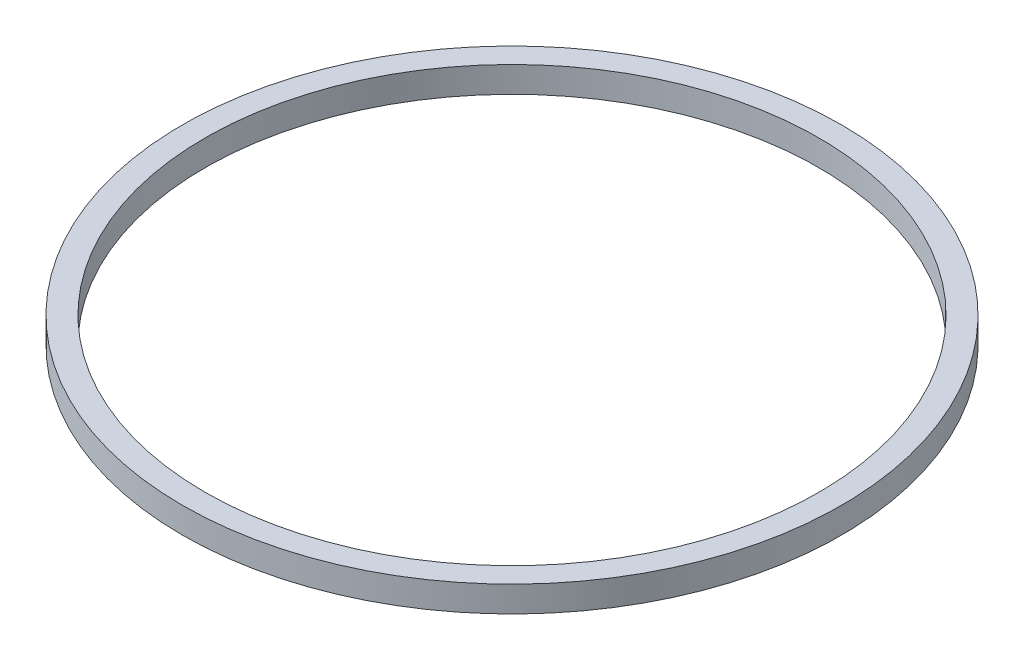
ISO-10303-21;
HEADER;
FILE_DESCRIPTION(('STEP AP214'),'2;1');
FILE_NAME('part.step','',(''),(''),'','','');
FILE_SCHEMA(('AUTOMOTIVE_DESIGN { 1 0 10303 214 1 1 1 1 }'));
ENDSEC;
DATA;
#1=APPLICATION_CONTEXT('core data for automotive mechanical design processes');
#2=APPLICATION_PROTOCOL_DEFINITION('international standard','automotive_design',2000,#1);
#3=PRODUCT_CONTEXT('',#1,'mechanical');
#4=PRODUCT('Part','Part','',(#3));
#5=PRODUCT_RELATED_PRODUCT_CATEGORY('part','',(#4));
#6=PRODUCT_DEFINITION_FORMATION('','',#4);
#7=PRODUCT_DEFINITION_CONTEXT('part definition',#1,'design');
#8=PRODUCT_DEFINITION('design','',#6,#7);
#9=PRODUCT_DEFINITION_SHAPE('','',#8);
#10=(LENGTH_UNIT() NAMED_UNIT(*) SI_UNIT(.MILLI.,.METRE.));
#11=(NAMED_UNIT(*) PLANE_ANGLE_UNIT() SI_UNIT($,.RADIAN.));
#12=(NAMED_UNIT(*) SI_UNIT($,.STERADIAN.) SOLID_ANGLE_UNIT());
#13=UNCERTAINTY_MEASURE_WITH_UNIT(LENGTH_MEASURE(1.E-05),#10,'distance_accuracy_value','');
#14=(GEOMETRIC_REPRESENTATION_CONTEXT(3) GLOBAL_UNCERTAINTY_ASSIGNED_CONTEXT((#13)) GLOBAL_UNIT_ASSIGNED_CONTEXT((#10,
#11,#12)) REPRESENTATION_CONTEXT('',''));
#15=CARTESIAN_POINT('',(0.,0.,0.));
#16=DIRECTION('',(0.,0.,1.));
#17=DIRECTION('',(1.,0.,0.));
#18=AXIS2_PLACEMENT_3D('',#15,#16,#17);
#19=CARTESIAN_POINT('',(0.,8.,0.));
#20=DIRECTION('',(0.,1.,0.));
#21=DIRECTION('',(0.,0.,1.));
#22=AXIS2_PLACEMENT_3D('',#19,#20,#21);
#23=PLANE('',#22);
#24=CARTESIAN_POINT('',(0.,8.,0.));
#25=DIRECTION('',(0.,1.,0.));
#26=DIRECTION('',(0.,0.,1.));
#27=AXIS2_PLACEMENT_3D('',#24,#25,#26);
#28=CIRCLE('',#27,102.);
#29=CARTESIAN_POINT('',(0.,8.,102.));
#30=VERTEX_POINT('',#29);
#31=EDGE_CURVE('E10',#30,#30,#28,.T.);
#32=ORIENTED_EDGE('',*,*,#31,.T.);
#33=EDGE_LOOP('',(#32));
#34=FACE_BOUND('',#33,.T.);
#35=CARTESIAN_POINT('',(0.,8.,0.));
#36=DIRECTION('',(0.,1.,0.));
#37=DIRECTION('',(0.,0.,1.));
#38=AXIS2_PLACEMENT_3D('',#35,#36,#37);
#39=CIRCLE('',#38,95.);
#40=CARTESIAN_POINT('',(0.,8.,95.));
#41=VERTEX_POINT('',#40);
#42=EDGE_CURVE('E48',#41,#41,#39,.T.);
#43=ORIENTED_EDGE('',*,*,#42,.F.);
#44=EDGE_LOOP('',(#43));
#45=FACE_BOUND('',#44,.T.);
#46=ADVANCED_FACE('F37',(#34,#45),#23,.T.);
#47=CARTESIAN_POINT('',(0.,0.,0.));
#48=DIRECTION('',(0.,1.,0.));
#49=DIRECTION('',(0.,0.,1.));
#50=AXIS2_PLACEMENT_3D('',#47,#48,#49);
#51=PLANE('',#50);
#52=CARTESIAN_POINT('',(0.,0.,0.));
#53=DIRECTION('',(0.,1.,0.));
#54=DIRECTION('',(0.,0.,1.));
#55=AXIS2_PLACEMENT_3D('',#52,#53,#54);
#56=CIRCLE('',#55,102.);
#57=CARTESIAN_POINT('',(0.,0.,102.));
#58=VERTEX_POINT('',#57);
#59=EDGE_CURVE('E41',#58,#58,#56,.T.);
#60=ORIENTED_EDGE('',*,*,#59,.F.);
#61=EDGE_LOOP('',(#60));
#62=FACE_BOUND('',#61,.T.);
#63=CARTESIAN_POINT('',(0.,0.,0.));
#64=DIRECTION('',(0.,1.,0.));
#65=DIRECTION('',(0.,0.,1.));
#66=AXIS2_PLACEMENT_3D('',#63,#64,#65);
#67=CIRCLE('',#66,95.);
#68=CARTESIAN_POINT('',(0.,0.,95.));
#69=VERTEX_POINT('',#68);
#70=EDGE_CURVE('E50',#69,#69,#67,.T.);
#71=ORIENTED_EDGE('',*,*,#70,.T.);
#72=EDGE_LOOP('',(#71));
#73=FACE_BOUND('',#72,.T.);
#74=ADVANCED_FACE('F60',(#62,#73),#51,.F.);
#75=CARTESIAN_POINT('',(0.,8.,0.));
#76=DIRECTION('',(0.,-1.,0.));
#77=DIRECTION('',(0.,0.,-1.));
#78=AXIS2_PLACEMENT_3D('',#75,#76,#77);
#79=CYLINDRICAL_SURFACE('',#78,102.);
#80=ORIENTED_EDGE('',*,*,#31,.F.);
#81=EDGE_LOOP('',(#80));
#82=FACE_BOUND('',#81,.T.);
#83=ORIENTED_EDGE('',*,*,#59,.T.);
#84=EDGE_LOOP('',(#83));
#85=FACE_BOUND('',#84,.T.);
#86=ADVANCED_FACE('F39',(#82,#85),#79,.T.);
#87=CARTESIAN_POINT('',(0.,8.,0.));
#88=DIRECTION('',(0.,-1.,0.));
#89=DIRECTION('',(0.,0.,-1.));
#90=AXIS2_PLACEMENT_3D('',#87,#88,#89);
#91=CYLINDRICAL_SURFACE('',#90,95.);
#92=ORIENTED_EDGE('',*,*,#42,.T.);
#93=EDGE_LOOP('',(#92));
#94=FACE_BOUND('',#93,.T.);
#95=ORIENTED_EDGE('',*,*,#70,.F.);
#96=EDGE_LOOP('',(#95));
#97=FACE_BOUND('',#96,.T.);
#98=ADVANCED_FACE('F56',(#94,#97),#91,.F.);
#99=CLOSED_SHELL('',(#46,#74,#86,#98));
#100=MANIFOLD_SOLID_BREP('B2',#99);
#101=ADVANCED_BREP_SHAPE_REPRESENTATION('',(#18,#100),#14);
#102=SHAPE_DEFINITION_REPRESENTATION(#9,#101);
ENDSEC;
END-ISO-10303-21;
